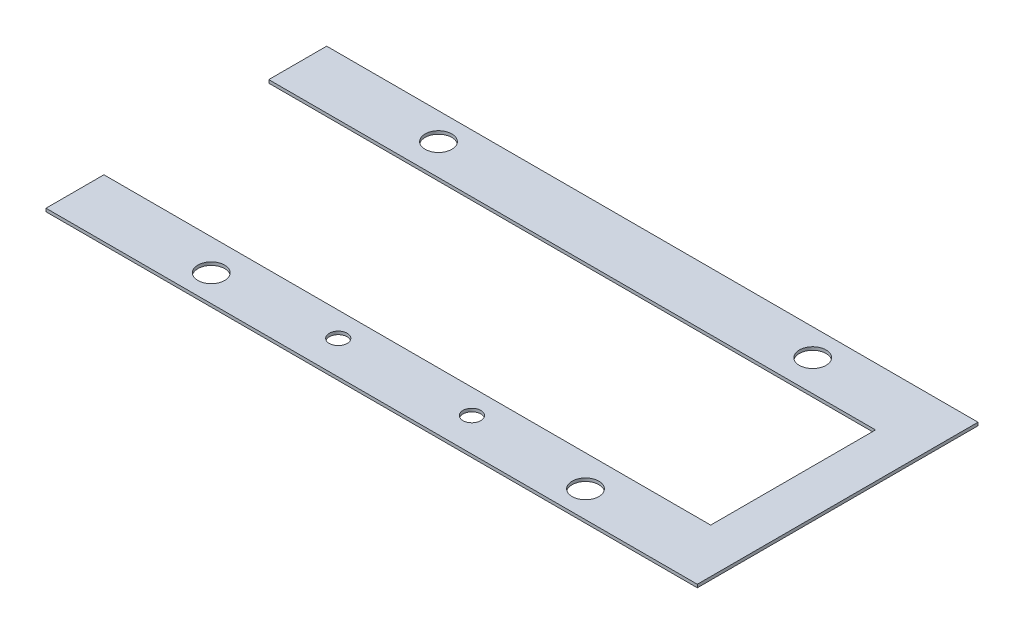
ISO-10303-21;
HEADER;
FILE_DESCRIPTION(('STEP AP214'),'2;1');
FILE_NAME('part.step','',(''),(''),'','','');
FILE_SCHEMA(('AUTOMOTIVE_DESIGN { 1 0 10303 214 1 1 1 1 }'));
ENDSEC;
DATA;
#1=APPLICATION_CONTEXT('core data for automotive mechanical design processes');
#2=APPLICATION_PROTOCOL_DEFINITION('international standard','automotive_design',2000,#1);
#3=PRODUCT_CONTEXT('',#1,'mechanical');
#4=PRODUCT('Part','Part','',(#3));
#5=PRODUCT_RELATED_PRODUCT_CATEGORY('part','',(#4));
#6=PRODUCT_DEFINITION_FORMATION('','',#4);
#7=PRODUCT_DEFINITION_CONTEXT('part definition',#1,'design');
#8=PRODUCT_DEFINITION('design','',#6,#7);
#9=PRODUCT_DEFINITION_SHAPE('','',#8);
#10=(LENGTH_UNIT() NAMED_UNIT(*) SI_UNIT(.MILLI.,.METRE.));
#11=(NAMED_UNIT(*) PLANE_ANGLE_UNIT() SI_UNIT($,.RADIAN.));
#12=(NAMED_UNIT(*) SI_UNIT($,.STERADIAN.) SOLID_ANGLE_UNIT());
#13=UNCERTAINTY_MEASURE_WITH_UNIT(LENGTH_MEASURE(1.E-05),#10,'distance_accuracy_value','');
#14=(GEOMETRIC_REPRESENTATION_CONTEXT(3) GLOBAL_UNCERTAINTY_ASSIGNED_CONTEXT((#13)) GLOBAL_UNIT_ASSIGNED_CONTEXT((#10,
#11,#12)) REPRESENTATION_CONTEXT('',''));
#15=CARTESIAN_POINT('',(0.,0.,0.));
#16=DIRECTION('',(0.,0.,1.));
#17=DIRECTION('',(1.,0.,0.));
#18=AXIS2_PLACEMENT_3D('',#15,#16,#17);
#19=CARTESIAN_POINT('',(-73.1,-12.01,31.));
#20=DIRECTION('',(0.,0.,1.));
#21=DIRECTION('',(1.,0.,0.));
#22=AXIS2_PLACEMENT_3D('',#19,#20,#21);
#23=PLANE('',#22);
#24=DIRECTION('',(-1.,0.,0.));
#25=VECTOR('',#24,1.);
#26=CARTESIAN_POINT('',(38.,0.,31.));
#27=LINE('',#26,#25);
#28=CARTESIAN_POINT('',(73.1,0.,31.));
#29=VERTEX_POINT('',#28);
#30=CARTESIAN_POINT('',(-73.1,0.,31.));
#31=VERTEX_POINT('',#30);
#32=EDGE_CURVE('E149',#29,#31,#27,.T.);
#33=ORIENTED_EDGE('',*,*,#32,.T.);
#34=DIRECTION('',(0.,1.,0.));
#35=VECTOR('',#34,1.);
#36=CARTESIAN_POINT('',(-73.1,-12.01,31.));
#37=LINE('',#36,#35);
#38=CARTESIAN_POINT('',(-73.1,-0.700000000000007,31.));
#39=VERTEX_POINT('',#38);
#40=EDGE_CURVE('E159',#39,#31,#37,.T.);
#41=ORIENTED_EDGE('',*,*,#40,.F.);
#42=DIRECTION('',(-1.,0.,0.));
#43=VECTOR('',#42,1.);
#44=CARTESIAN_POINT('',(38.,-0.7,31.));
#45=LINE('',#44,#43);
#46=CARTESIAN_POINT('',(73.1,-0.700000000000021,31.));
#47=VERTEX_POINT('',#46);
#48=EDGE_CURVE('E152',#47,#39,#45,.T.);
#49=ORIENTED_EDGE('',*,*,#48,.F.);
#50=DIRECTION('',(0.,1.,0.));
#51=VECTOR('',#50,1.);
#52=CARTESIAN_POINT('',(73.1,-12.01,31.));
#53=LINE('',#52,#51);
#54=EDGE_CURVE('E156',#47,#29,#53,.T.);
#55=ORIENTED_EDGE('',*,*,#54,.T.);
#56=EDGE_LOOP('',(#33,#41,#49,#55));
#57=FACE_BOUND('',#56,.T.);
#58=ADVANCED_FACE('F36',(#57),#23,.T.);
#59=CARTESIAN_POINT('',(-73.1,-12.01,31.));
#60=DIRECTION('',(-1.,0.,0.));
#61=DIRECTION('',(0.,0.,1.));
#62=AXIS2_PLACEMENT_3D('',#59,#60,#61);
#63=PLANE('',#62);
#64=DIRECTION('',(0.,1.,0.));
#65=VECTOR('',#64,1.);
#66=CARTESIAN_POINT('',(-73.1,-12.01,18.));
#67=LINE('',#66,#65);
#68=CARTESIAN_POINT('',(-73.1,-0.700000000000007,18.));
#69=VERTEX_POINT('',#68);
#70=CARTESIAN_POINT('',(-73.1,0.,18.));
#71=VERTEX_POINT('',#70);
#72=EDGE_CURVE('E161',#69,#71,#67,.T.);
#73=ORIENTED_EDGE('',*,*,#72,.F.);
#74=DIRECTION('',(0.,0.,-1.));
#75=VECTOR('',#74,1.);
#76=CARTESIAN_POINT('',(-73.1,-0.700000000000007,-45.));
#77=LINE('',#76,#75);
#78=EDGE_CURVE('E40',#69,#39,#77,.F.);
#79=ORIENTED_EDGE('',*,*,#78,.T.);
#80=ORIENTED_EDGE('',*,*,#40,.T.);
#81=DIRECTION('',(0.,0.,-1.));
#82=VECTOR('',#81,1.);
#83=CARTESIAN_POINT('',(-73.1,0.,-45.));
#84=LINE('',#83,#82);
#85=EDGE_CURVE('E165',#71,#31,#84,.F.);
#86=ORIENTED_EDGE('',*,*,#85,.F.);
#87=EDGE_LOOP('',(#73,#79,#80,#86));
#88=FACE_BOUND('',#87,.T.);
#89=ADVANCED_FACE('F185',(#88),#63,.T.);
#90=CARTESIAN_POINT('',(63.1,-12.01,18.));
#91=DIRECTION('',(0.,0.,-1.));
#92=DIRECTION('',(-1.,0.,0.));
#93=AXIS2_PLACEMENT_3D('',#90,#91,#92);
#94=PLANE('',#93);
#95=DIRECTION('',(0.,1.,0.));
#96=VECTOR('',#95,1.);
#97=CARTESIAN_POINT('',(63.1,-12.01,18.));
#98=LINE('',#97,#96);
#99=CARTESIAN_POINT('',(63.1,-0.7,18.));
#100=VERTEX_POINT('',#99);
#101=CARTESIAN_POINT('',(63.1,0.,18.));
#102=VERTEX_POINT('',#101);
#103=EDGE_CURVE('E109',#100,#102,#98,.T.);
#104=ORIENTED_EDGE('',*,*,#103,.F.);
#105=DIRECTION('',(-1.,0.,0.));
#106=VECTOR('',#105,1.);
#107=CARTESIAN_POINT('',(0.,-0.7,18.));
#108=LINE('',#107,#106);
#109=EDGE_CURVE('E117',#100,#69,#108,.T.);
#110=ORIENTED_EDGE('',*,*,#109,.T.);
#111=ORIENTED_EDGE('',*,*,#72,.T.);
#112=DIRECTION('',(-1.,0.,0.));
#113=VECTOR('',#112,1.);
#114=CARTESIAN_POINT('',(0.,0.,18.));
#115=LINE('',#114,#113);
#116=EDGE_CURVE('E173',#102,#71,#115,.T.);
#117=ORIENTED_EDGE('',*,*,#116,.F.);
#118=EDGE_LOOP('',(#104,#110,#111,#117));
#119=FACE_BOUND('',#118,.T.);
#120=ADVANCED_FACE('F195',(#119),#94,.T.);
#121=CARTESIAN_POINT('',(63.1,-12.01,-19.));
#122=DIRECTION('',(-1.,0.,0.));
#123=DIRECTION('',(0.,0.,1.));
#124=AXIS2_PLACEMENT_3D('',#121,#122,#123);
#125=PLANE('',#124);
#126=DIRECTION('',(0.,1.,0.));
#127=VECTOR('',#126,1.);
#128=CARTESIAN_POINT('',(63.1,-12.01,-19.));
#129=LINE('',#128,#127);
#130=CARTESIAN_POINT('',(63.1,-0.7,-19.));
#131=VERTEX_POINT('',#130);
#132=CARTESIAN_POINT('',(63.1,0.,-19.));
#133=VERTEX_POINT('',#132);
#134=EDGE_CURVE('E102',#131,#133,#129,.T.);
#135=ORIENTED_EDGE('',*,*,#134,.F.);
#136=DIRECTION('',(0.,0.,1.));
#137=VECTOR('',#136,1.);
#138=CARTESIAN_POINT('',(63.1,-0.7,0.));
#139=LINE('',#138,#137);
#140=EDGE_CURVE('E105',#131,#100,#139,.T.);
#141=ORIENTED_EDGE('',*,*,#140,.T.);
#142=ORIENTED_EDGE('',*,*,#103,.T.);
#143=DIRECTION('',(0.,0.,1.));
#144=VECTOR('',#143,1.);
#145=CARTESIAN_POINT('',(63.1,0.,0.));
#146=LINE('',#145,#144);
#147=EDGE_CURVE('E107',#133,#102,#146,.T.);
#148=ORIENTED_EDGE('',*,*,#147,.F.);
#149=EDGE_LOOP('',(#135,#141,#142,#148));
#150=FACE_BOUND('',#149,.T.);
#151=ADVANCED_FACE('F104',(#150),#125,.T.);
#152=CARTESIAN_POINT('',(73.1,-12.01,31.));
#153=DIRECTION('',(1.,0.,0.));
#154=DIRECTION('',(0.,0.,-1.));
#155=AXIS2_PLACEMENT_3D('',#152,#153,#154);
#156=PLANE('',#155);
#157=ORIENTED_EDGE('',*,*,#54,.F.);
#158=DIRECTION('',(0.,0.,1.));
#159=VECTOR('',#158,1.);
#160=CARTESIAN_POINT('',(73.1,-0.700000000000021,45.));
#161=LINE('',#160,#159);
#162=CARTESIAN_POINT('',(73.1,-0.700000000000021,-32.));
#163=VERTEX_POINT('',#162);
#164=EDGE_CURVE('E128',#47,#163,#161,.F.);
#165=ORIENTED_EDGE('',*,*,#164,.T.);
#166=DIRECTION('',(0.,1.,0.));
#167=VECTOR('',#166,1.);
#168=CARTESIAN_POINT('',(73.1,-12.01,-32.));
#169=LINE('',#168,#167);
#170=CARTESIAN_POINT('',(73.1,0.,-32.));
#171=VERTEX_POINT('',#170);
#172=EDGE_CURVE('E11',#163,#171,#169,.T.);
#173=ORIENTED_EDGE('',*,*,#172,.T.);
#174=DIRECTION('',(0.,0.,1.));
#175=VECTOR('',#174,1.);
#176=CARTESIAN_POINT('',(73.1,0.,45.));
#177=LINE('',#176,#175);
#178=EDGE_CURVE('E151',#29,#171,#177,.F.);
#179=ORIENTED_EDGE('',*,*,#178,.F.);
#180=EDGE_LOOP('',(#157,#165,#173,#179));
#181=FACE_BOUND('',#180,.T.);
#182=ADVANCED_FACE('F183',(#181),#156,.T.);
#183=CARTESIAN_POINT('',(-73.1,-12.01,-19.));
#184=DIRECTION('',(-1.,0.,0.));
#185=DIRECTION('',(0.,0.,1.));
#186=AXIS2_PLACEMENT_3D('',#183,#184,#185);
#187=PLANE('',#186);
#188=DIRECTION('',(0.,1.,0.));
#189=VECTOR('',#188,1.);
#190=CARTESIAN_POINT('',(-73.1,-12.01,-32.));
#191=LINE('',#190,#189);
#192=CARTESIAN_POINT('',(-73.1,-0.700000000000007,-32.));
#193=VERTEX_POINT('',#192);
#194=CARTESIAN_POINT('',(-73.1,0.,-32.));
#195=VERTEX_POINT('',#194);
#196=EDGE_CURVE('E45',#193,#195,#191,.T.);
#197=ORIENTED_EDGE('',*,*,#196,.F.);
#198=CARTESIAN_POINT('',(-73.1,-0.700000000000007,-19.));
#199=VERTEX_POINT('',#198);
#200=EDGE_CURVE('E130',#193,#199,#77,.F.);
#201=ORIENTED_EDGE('',*,*,#200,.T.);
#202=DIRECTION('',(0.,1.,0.));
#203=VECTOR('',#202,1.);
#204=CARTESIAN_POINT('',(-73.1,-12.01,-19.));
#205=LINE('',#204,#203);
#206=CARTESIAN_POINT('',(-73.1,0.,-19.));
#207=VERTEX_POINT('',#206);
#208=EDGE_CURVE('E60',#199,#207,#205,.T.);
#209=ORIENTED_EDGE('',*,*,#208,.T.);
#210=EDGE_CURVE('E168',#195,#207,#84,.F.);
#211=ORIENTED_EDGE('',*,*,#210,.F.);
#212=EDGE_LOOP('',(#197,#201,#209,#211));
#213=FACE_BOUND('',#212,.T.);
#214=ADVANCED_FACE('F180',(#213),#187,.T.);
#215=CARTESIAN_POINT('',(-73.1,-12.01,-32.));
#216=DIRECTION('',(0.,0.,-1.));
#217=DIRECTION('',(-1.,0.,0.));
#218=AXIS2_PLACEMENT_3D('',#215,#216,#217);
#219=PLANE('',#218);
#220=ORIENTED_EDGE('',*,*,#172,.F.);
#221=DIRECTION('',(-1.,0.,0.));
#222=VECTOR('',#221,1.);
#223=CARTESIAN_POINT('',(0.,-0.7,-32.));
#224=LINE('',#223,#222);
#225=EDGE_CURVE('E126',#163,#193,#224,.T.);
#226=ORIENTED_EDGE('',*,*,#225,.T.);
#227=ORIENTED_EDGE('',*,*,#196,.T.);
#228=DIRECTION('',(-1.,0.,0.));
#229=VECTOR('',#228,1.);
#230=CARTESIAN_POINT('',(0.,0.,-32.));
#231=LINE('',#230,#229);
#232=EDGE_CURVE('E153',#171,#195,#231,.T.);
#233=ORIENTED_EDGE('',*,*,#232,.F.);
#234=EDGE_LOOP('',(#220,#226,#227,#233));
#235=FACE_BOUND('',#234,.T.);
#236=ADVANCED_FACE('F182',(#235),#219,.T.);
#237=CARTESIAN_POINT('',(-73.1,-12.01,-19.));
#238=DIRECTION('',(0.,0.,1.));
#239=DIRECTION('',(1.,0.,0.));
#240=AXIS2_PLACEMENT_3D('',#237,#238,#239);
#241=PLANE('',#240);
#242=ORIENTED_EDGE('',*,*,#208,.F.);
#243=DIRECTION('',(1.,0.,0.));
#244=VECTOR('',#243,1.);
#245=CARTESIAN_POINT('',(0.,-0.7,-19.));
#246=LINE('',#245,#244);
#247=EDGE_CURVE('E114',#199,#131,#246,.T.);
#248=ORIENTED_EDGE('',*,*,#247,.T.);
#249=ORIENTED_EDGE('',*,*,#134,.T.);
#250=DIRECTION('',(1.,0.,0.));
#251=VECTOR('',#250,1.);
#252=CARTESIAN_POINT('',(0.,0.,-19.));
#253=LINE('',#252,#251);
#254=EDGE_CURVE('E120',#207,#133,#253,.T.);
#255=ORIENTED_EDGE('',*,*,#254,.F.);
#256=EDGE_LOOP('',(#242,#248,#249,#255));
#257=FACE_BOUND('',#256,.T.);
#258=ADVANCED_FACE('F119',(#257),#241,.T.);
#259=CARTESIAN_POINT('',(0.,-0.7,0.));
#260=DIRECTION('',(0.,1.,0.));
#261=DIRECTION('',(0.,0.,1.));
#262=AXIS2_PLACEMENT_3D('',#259,#260,#261);
#263=PLANE('',#262);
#264=CARTESIAN_POINT('',(-15.,-0.699999999999999,23.5));
#265=DIRECTION('',(0.,1.,0.));
#266=DIRECTION('',(0.,0.,1.));
#267=AXIS2_PLACEMENT_3D('',#264,#265,#266);
#268=CIRCLE('',#267,2.);
#269=CARTESIAN_POINT('',(-15.,-0.699999999999999,25.5));
#270=VERTEX_POINT('',#269);
#271=EDGE_CURVE('E208',#270,#270,#268,.T.);
#272=ORIENTED_EDGE('',*,*,#271,.T.);
#273=EDGE_LOOP('',(#272));
#274=FACE_BOUND('',#273,.T.);
#275=CARTESIAN_POINT('',(15.,-0.699999999999999,23.5));
#276=DIRECTION('',(0.,1.,0.));
#277=DIRECTION('',(0.,0.,1.));
#278=AXIS2_PLACEMENT_3D('',#275,#276,#277);
#279=CIRCLE('',#278,2.);
#280=CARTESIAN_POINT('',(15.,-0.699999999999999,25.5));
#281=VERTEX_POINT('',#280);
#282=EDGE_CURVE('E211',#281,#281,#279,.T.);
#283=ORIENTED_EDGE('',*,*,#282,.T.);
#284=EDGE_LOOP('',(#283));
#285=FACE_BOUND('',#284,.T.);
#286=CARTESIAN_POINT('',(-42.,-0.699999999999999,-26.));
#287=DIRECTION('',(0.,1.,0.));
#288=DIRECTION('',(0.,0.,1.));
#289=AXIS2_PLACEMENT_3D('',#286,#287,#288);
#290=CIRCLE('',#289,3.);
#291=CARTESIAN_POINT('',(-42.,-0.699999999999999,-23.));
#292=VERTEX_POINT('',#291);
#293=EDGE_CURVE('E136',#292,#292,#290,.T.);
#294=ORIENTED_EDGE('',*,*,#293,.T.);
#295=EDGE_LOOP('',(#294));
#296=FACE_BOUND('',#295,.T.);
#297=CARTESIAN_POINT('',(42.,-0.699999999999999,25.));
#298=DIRECTION('',(0.,1.,0.));
#299=DIRECTION('',(0.,0.,1.));
#300=AXIS2_PLACEMENT_3D('',#297,#298,#299);
#301=CIRCLE('',#300,3.);
#302=CARTESIAN_POINT('',(42.,-0.699999999999999,28.));
#303=VERTEX_POINT('',#302);
#304=EDGE_CURVE('E140',#303,#303,#301,.T.);
#305=ORIENTED_EDGE('',*,*,#304,.T.);
#306=EDGE_LOOP('',(#305));
#307=FACE_BOUND('',#306,.T.);
#308=CARTESIAN_POINT('',(42.,-0.699999999999999,-26.));
#309=DIRECTION('',(0.,1.,0.));
#310=DIRECTION('',(0.,0.,1.));
#311=AXIS2_PLACEMENT_3D('',#308,#309,#310);
#312=CIRCLE('',#311,3.);
#313=CARTESIAN_POINT('',(42.,-0.699999999999999,-23.));
#314=VERTEX_POINT('',#313);
#315=EDGE_CURVE('E145',#314,#314,#312,.T.);
#316=ORIENTED_EDGE('',*,*,#315,.T.);
#317=EDGE_LOOP('',(#316));
#318=FACE_BOUND('',#317,.T.);
#319=CARTESIAN_POINT('',(-42.,-0.699999999999999,25.));
#320=DIRECTION('',(0.,1.,0.));
#321=DIRECTION('',(0.,0.,1.));
#322=AXIS2_PLACEMENT_3D('',#319,#320,#321);
#323=CIRCLE('',#322,3.);
#324=CARTESIAN_POINT('',(-42.,-0.699999999999999,28.));
#325=VERTEX_POINT('',#324);
#326=EDGE_CURVE('E220',#325,#325,#323,.T.);
#327=ORIENTED_EDGE('',*,*,#326,.T.);
#328=EDGE_LOOP('',(#327));
#329=FACE_BOUND('',#328,.T.);
#330=ORIENTED_EDGE('',*,*,#247,.F.);
#331=ORIENTED_EDGE('',*,*,#200,.F.);
#332=ORIENTED_EDGE('',*,*,#225,.F.);
#333=ORIENTED_EDGE('',*,*,#164,.F.);
#334=ORIENTED_EDGE('',*,*,#48,.T.);
#335=ORIENTED_EDGE('',*,*,#78,.F.);
#336=ORIENTED_EDGE('',*,*,#109,.F.);
#337=ORIENTED_EDGE('',*,*,#140,.F.);
#338=EDGE_LOOP('',(#330,#331,#332,#333,#334,#335,#336,#337));
#339=FACE_BOUND('',#338,.T.);
#340=ADVANCED_FACE('F38',(#274,#285,#296,#307,#318,#329,#339),#263,.F.);
#341=CARTESIAN_POINT('',(0.,0.,0.));
#342=DIRECTION('',(0.,1.,0.));
#343=DIRECTION('',(0.,0.,1.));
#344=AXIS2_PLACEMENT_3D('',#341,#342,#343);
#345=PLANE('',#344);
#346=CARTESIAN_POINT('',(-15.,0.,23.5));
#347=DIRECTION('',(0.,1.,0.));
#348=DIRECTION('',(0.,0.,1.));
#349=AXIS2_PLACEMENT_3D('',#346,#347,#348);
#350=CIRCLE('',#349,2.);
#351=CARTESIAN_POINT('',(-15.,0.,25.5));
#352=VERTEX_POINT('',#351);
#353=EDGE_CURVE('E238',#352,#352,#350,.T.);
#354=ORIENTED_EDGE('',*,*,#353,.F.);
#355=EDGE_LOOP('',(#354));
#356=FACE_BOUND('',#355,.T.);
#357=CARTESIAN_POINT('',(15.,0.,23.5));
#358=DIRECTION('',(0.,1.,0.));
#359=DIRECTION('',(0.,0.,-1.));
#360=AXIS2_PLACEMENT_3D('',#357,#358,#359);
#361=CIRCLE('',#360,2.);
#362=CARTESIAN_POINT('',(15.,0.,21.5));
#363=VERTEX_POINT('',#362);
#364=EDGE_CURVE('E239',#363,#363,#361,.T.);
#365=ORIENTED_EDGE('',*,*,#364,.F.);
#366=EDGE_LOOP('',(#365));
#367=FACE_BOUND('',#366,.T.);
#368=CARTESIAN_POINT('',(-42.,0.,-26.));
#369=DIRECTION('',(0.,1.,0.));
#370=DIRECTION('',(0.,0.,1.));
#371=AXIS2_PLACEMENT_3D('',#368,#369,#370);
#372=CIRCLE('',#371,3.);
#373=CARTESIAN_POINT('',(-42.,0.,-23.));
#374=VERTEX_POINT('',#373);
#375=EDGE_CURVE('E225',#374,#374,#372,.T.);
#376=ORIENTED_EDGE('',*,*,#375,.F.);
#377=EDGE_LOOP('',(#376));
#378=FACE_BOUND('',#377,.T.);
#379=CARTESIAN_POINT('',(42.,0.,25.));
#380=DIRECTION('',(0.,1.,0.));
#381=DIRECTION('',(0.,0.,-1.));
#382=AXIS2_PLACEMENT_3D('',#379,#380,#381);
#383=CIRCLE('',#382,3.);
#384=CARTESIAN_POINT('',(42.,0.,22.));
#385=VERTEX_POINT('',#384);
#386=EDGE_CURVE('E228',#385,#385,#383,.T.);
#387=ORIENTED_EDGE('',*,*,#386,.F.);
#388=EDGE_LOOP('',(#387));
#389=FACE_BOUND('',#388,.T.);
#390=CARTESIAN_POINT('',(42.,0.,-26.));
#391=DIRECTION('',(0.,1.,0.));
#392=DIRECTION('',(0.,0.,-1.));
#393=AXIS2_PLACEMENT_3D('',#390,#391,#392);
#394=CIRCLE('',#393,3.);
#395=CARTESIAN_POINT('',(42.,0.,-29.));
#396=VERTEX_POINT('',#395);
#397=EDGE_CURVE('E231',#396,#396,#394,.T.);
#398=ORIENTED_EDGE('',*,*,#397,.F.);
#399=EDGE_LOOP('',(#398));
#400=FACE_BOUND('',#399,.T.);
#401=CARTESIAN_POINT('',(-42.,0.,25.));
#402=DIRECTION('',(0.,1.,0.));
#403=DIRECTION('',(0.,0.,1.));
#404=AXIS2_PLACEMENT_3D('',#401,#402,#403);
#405=CIRCLE('',#404,3.);
#406=CARTESIAN_POINT('',(-42.,0.,28.));
#407=VERTEX_POINT('',#406);
#408=EDGE_CURVE('E222',#407,#407,#405,.T.);
#409=ORIENTED_EDGE('',*,*,#408,.F.);
#410=EDGE_LOOP('',(#409));
#411=FACE_BOUND('',#410,.T.);
#412=ORIENTED_EDGE('',*,*,#210,.T.);
#413=ORIENTED_EDGE('',*,*,#254,.T.);
#414=ORIENTED_EDGE('',*,*,#147,.T.);
#415=ORIENTED_EDGE('',*,*,#116,.T.);
#416=ORIENTED_EDGE('',*,*,#85,.T.);
#417=ORIENTED_EDGE('',*,*,#32,.F.);
#418=ORIENTED_EDGE('',*,*,#178,.T.);
#419=ORIENTED_EDGE('',*,*,#232,.T.);
#420=EDGE_LOOP('',(#412,#413,#414,#415,#416,#417,#418,#419));
#421=FACE_BOUND('',#420,.T.);
#422=ADVANCED_FACE('F177',(#356,#367,#378,#389,#400,#411,#421),#345,.T.);
#423=CARTESIAN_POINT('',(-42.,-10.,25.));
#424=DIRECTION('',(0.,1.,0.));
#425=DIRECTION('',(0.,0.,1.));
#426=AXIS2_PLACEMENT_3D('',#423,#424,#425);
#427=CYLINDRICAL_SURFACE('',#426,3.);
#428=ORIENTED_EDGE('',*,*,#408,.T.);
#429=EDGE_LOOP('',(#428));
#430=FACE_BOUND('',#429,.T.);
#431=ORIENTED_EDGE('',*,*,#326,.F.);
#432=EDGE_LOOP('',(#431));
#433=FACE_BOUND('',#432,.T.);
#434=ADVANCED_FACE('F196',(#430,#433),#427,.F.);
#435=CARTESIAN_POINT('',(42.,-10.,-26.));
#436=DIRECTION('',(0.,1.,0.));
#437=DIRECTION('',(0.,0.,1.));
#438=AXIS2_PLACEMENT_3D('',#435,#436,#437);
#439=CYLINDRICAL_SURFACE('',#438,3.);
#440=ORIENTED_EDGE('',*,*,#397,.T.);
#441=EDGE_LOOP('',(#440));
#442=FACE_BOUND('',#441,.T.);
#443=ORIENTED_EDGE('',*,*,#315,.F.);
#444=EDGE_LOOP('',(#443));
#445=FACE_BOUND('',#444,.T.);
#446=ADVANCED_FACE('F259',(#442,#445),#439,.F.);
#447=CARTESIAN_POINT('',(42.,-10.,25.));
#448=DIRECTION('',(0.,1.,0.));
#449=DIRECTION('',(0.,0.,1.));
#450=AXIS2_PLACEMENT_3D('',#447,#448,#449);
#451=CYLINDRICAL_SURFACE('',#450,3.);
#452=ORIENTED_EDGE('',*,*,#386,.T.);
#453=EDGE_LOOP('',(#452));
#454=FACE_BOUND('',#453,.T.);
#455=ORIENTED_EDGE('',*,*,#304,.F.);
#456=EDGE_LOOP('',(#455));
#457=FACE_BOUND('',#456,.T.);
#458=ADVANCED_FACE('F264',(#454,#457),#451,.F.);
#459=CARTESIAN_POINT('',(-42.,-10.,-26.));
#460=DIRECTION('',(0.,1.,0.));
#461=DIRECTION('',(0.,0.,1.));
#462=AXIS2_PLACEMENT_3D('',#459,#460,#461);
#463=CYLINDRICAL_SURFACE('',#462,3.);
#464=ORIENTED_EDGE('',*,*,#375,.T.);
#465=EDGE_LOOP('',(#464));
#466=FACE_BOUND('',#465,.T.);
#467=ORIENTED_EDGE('',*,*,#293,.F.);
#468=EDGE_LOOP('',(#467));
#469=FACE_BOUND('',#468,.T.);
#470=ADVANCED_FACE('F270',(#466,#469),#463,.F.);
#471=CARTESIAN_POINT('',(15.,-10.,23.5));
#472=DIRECTION('',(0.,1.,0.));
#473=DIRECTION('',(0.,0.,1.));
#474=AXIS2_PLACEMENT_3D('',#471,#472,#473);
#475=CYLINDRICAL_SURFACE('',#474,2.);
#476=ORIENTED_EDGE('',*,*,#364,.T.);
#477=EDGE_LOOP('',(#476));
#478=FACE_BOUND('',#477,.T.);
#479=ORIENTED_EDGE('',*,*,#282,.F.);
#480=EDGE_LOOP('',(#479));
#481=FACE_BOUND('',#480,.T.);
#482=ADVANCED_FACE('F273',(#478,#481),#475,.F.);
#483=CARTESIAN_POINT('',(-15.,-10.,23.5));
#484=DIRECTION('',(0.,1.,0.));
#485=DIRECTION('',(0.,0.,1.));
#486=AXIS2_PLACEMENT_3D('',#483,#484,#485);
#487=CYLINDRICAL_SURFACE('',#486,2.);
#488=ORIENTED_EDGE('',*,*,#353,.T.);
#489=EDGE_LOOP('',(#488));
#490=FACE_BOUND('',#489,.T.);
#491=ORIENTED_EDGE('',*,*,#271,.F.);
#492=EDGE_LOOP('',(#491));
#493=FACE_BOUND('',#492,.T.);
#494=ADVANCED_FACE('F245',(#490,#493),#487,.F.);
#495=CLOSED_SHELL('',(#58,#89,#120,#151,#182,#214,#236,#258,#340,#422,#434,#446,#458,#470,#482,#494));
#496=MANIFOLD_SOLID_BREP('B2',#495);
#497=ADVANCED_BREP_SHAPE_REPRESENTATION('',(#18,#496),#14);
#498=SHAPE_DEFINITION_REPRESENTATION(#9,#497);
ENDSEC;
END-ISO-10303-21;
